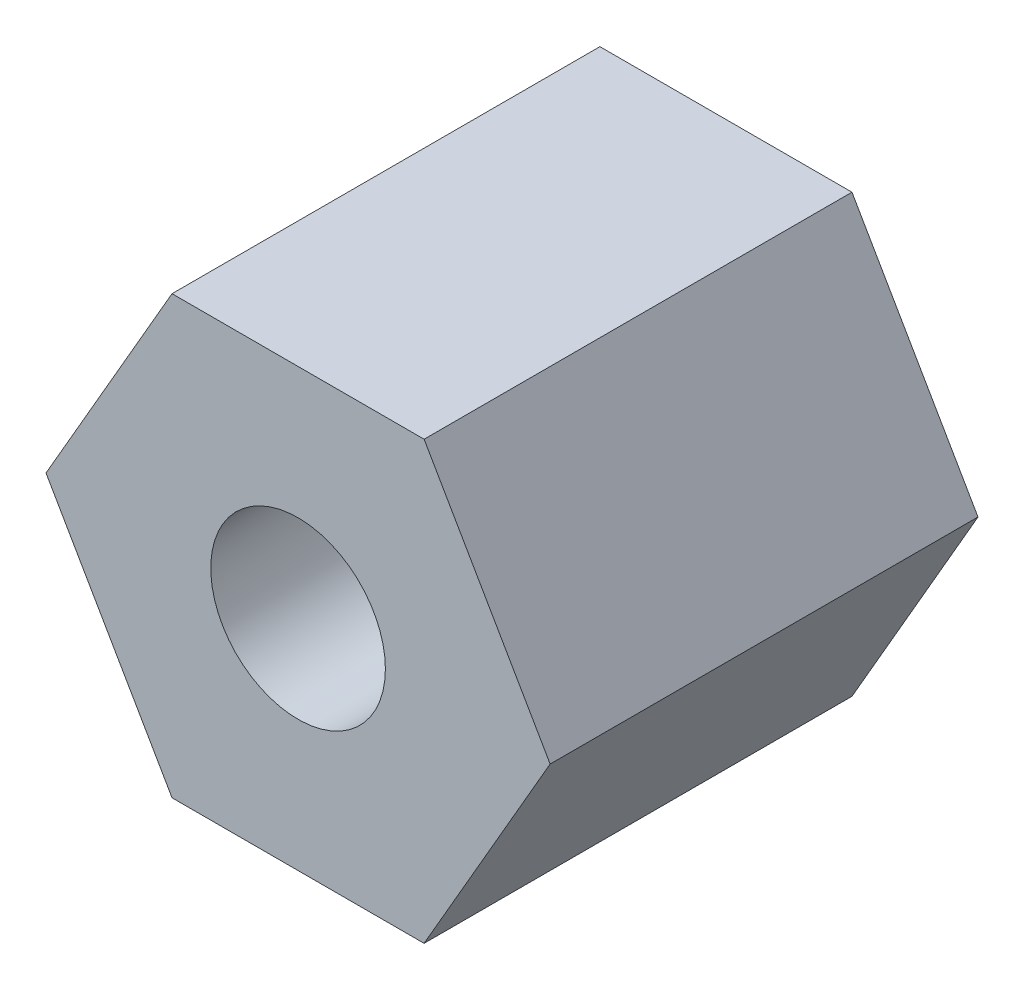
ISO-10303-21;
HEADER;
FILE_DESCRIPTION(('STEP AP214'),'2;1');
FILE_NAME('part.step','',(''),(''),'','','');
FILE_SCHEMA(('AUTOMOTIVE_DESIGN { 1 0 10303 214 1 1 1 1 }'));
ENDSEC;
DATA;
#1=APPLICATION_CONTEXT('core data for automotive mechanical design processes');
#2=APPLICATION_PROTOCOL_DEFINITION('international standard','automotive_design',2000,#1);
#3=PRODUCT_CONTEXT('',#1,'mechanical');
#4=PRODUCT('Part','Part','',(#3));
#5=PRODUCT_RELATED_PRODUCT_CATEGORY('part','',(#4));
#6=PRODUCT_DEFINITION_FORMATION('','',#4);
#7=PRODUCT_DEFINITION_CONTEXT('part definition',#1,'design');
#8=PRODUCT_DEFINITION('design','',#6,#7);
#9=PRODUCT_DEFINITION_SHAPE('','',#8);
#10=(LENGTH_UNIT() NAMED_UNIT(*) SI_UNIT(.MILLI.,.METRE.));
#11=(NAMED_UNIT(*) PLANE_ANGLE_UNIT() SI_UNIT($,.RADIAN.));
#12=(NAMED_UNIT(*) SI_UNIT($,.STERADIAN.) SOLID_ANGLE_UNIT());
#13=UNCERTAINTY_MEASURE_WITH_UNIT(LENGTH_MEASURE(1.E-05),#10,'distance_accuracy_value','');
#14=(GEOMETRIC_REPRESENTATION_CONTEXT(3) GLOBAL_UNCERTAINTY_ASSIGNED_CONTEXT((#13)) GLOBAL_UNIT_ASSIGNED_CONTEXT((#10,
#11,#12)) REPRESENTATION_CONTEXT('',''));
#15=CARTESIAN_POINT('',(0.,0.,0.));
#16=DIRECTION('',(0.,0.,1.));
#17=DIRECTION('',(1.,0.,0.));
#18=AXIS2_PLACEMENT_3D('',#15,#16,#17);
#19=CARTESIAN_POINT('',(0.,0.,9.8));
#20=DIRECTION('',(0.,0.,1.));
#21=DIRECTION('',(1.,0.,0.));
#22=AXIS2_PLACEMENT_3D('',#19,#20,#21);
#23=PLANE('',#22);
#24=DIRECTION('',(1.,0.,0.));
#25=VECTOR('',#24,1.);
#26=CARTESIAN_POINT('',(-2.88675134594813,-5.,9.8));
#27=LINE('',#26,#25);
#28=CARTESIAN_POINT('',(-2.88675134594813,-5.,9.8));
#29=VERTEX_POINT('',#28);
#30=CARTESIAN_POINT('',(2.88675134594813,-5.,9.8));
#31=VERTEX_POINT('',#30);
#32=EDGE_CURVE('E131',#29,#31,#27,.T.);
#33=ORIENTED_EDGE('',*,*,#32,.T.);
#34=DIRECTION('',(0.5,0.866025403784439,0.));
#35=VECTOR('',#34,1.);
#36=CARTESIAN_POINT('',(2.88675134594813,-5.,9.8));
#37=LINE('',#36,#35);
#38=CARTESIAN_POINT('',(5.77350269189626,0.,9.8));
#39=VERTEX_POINT('',#38);
#40=EDGE_CURVE('E89',#31,#39,#37,.T.);
#41=ORIENTED_EDGE('',*,*,#40,.T.);
#42=DIRECTION('',(-0.5,0.866025403784438,0.));
#43=VECTOR('',#42,1.);
#44=CARTESIAN_POINT('',(5.77350269189626,0.,9.8));
#45=LINE('',#44,#43);
#46=CARTESIAN_POINT('',(2.88675134594813,5.,9.8));
#47=VERTEX_POINT('',#46);
#48=EDGE_CURVE('E102',#39,#47,#45,.T.);
#49=ORIENTED_EDGE('',*,*,#48,.T.);
#50=DIRECTION('',(-1.,0.,0.));
#51=VECTOR('',#50,1.);
#52=CARTESIAN_POINT('',(2.88675134594813,5.,9.8));
#53=LINE('',#52,#51);
#54=CARTESIAN_POINT('',(-2.88675134594813,5.,9.8));
#55=VERTEX_POINT('',#54);
#56=EDGE_CURVE('E96',#47,#55,#53,.T.);
#57=ORIENTED_EDGE('',*,*,#56,.T.);
#58=DIRECTION('',(-0.5,-0.866025403784439,0.));
#59=VECTOR('',#58,1.);
#60=CARTESIAN_POINT('',(-2.88675134594813,5.,9.8));
#61=LINE('',#60,#59);
#62=CARTESIAN_POINT('',(-5.77350269189626,0.,9.8));
#63=VERTEX_POINT('',#62);
#64=EDGE_CURVE('E100',#55,#63,#61,.T.);
#65=ORIENTED_EDGE('',*,*,#64,.T.);
#66=DIRECTION('',(0.5,-0.866025403784439,0.));
#67=VECTOR('',#66,1.);
#68=CARTESIAN_POINT('',(-5.77350269189626,0.,9.8));
#69=LINE('',#68,#67);
#70=EDGE_CURVE('E52',#63,#29,#69,.T.);
#71=ORIENTED_EDGE('',*,*,#70,.T.);
#72=EDGE_LOOP('',(#33,#41,#49,#57,#65,#71));
#73=FACE_BOUND('',#72,.T.);
#74=CARTESIAN_POINT('',(0.,0.,9.8));
#75=DIRECTION('',(0.,0.,1.));
#76=DIRECTION('',(1.,0.,0.));
#77=AXIS2_PLACEMENT_3D('',#74,#75,#76);
#78=CIRCLE('',#77,2.);
#79=CARTESIAN_POINT('',(2.,0.,9.8));
#80=VERTEX_POINT('',#79);
#81=EDGE_CURVE('E124',#80,#80,#78,.T.);
#82=ORIENTED_EDGE('',*,*,#81,.F.);
#83=EDGE_LOOP('',(#82));
#84=FACE_BOUND('',#83,.T.);
#85=ADVANCED_FACE('F35',(#73,#84),#23,.T.);
#86=CARTESIAN_POINT('',(0.,0.,0.));
#87=DIRECTION('',(0.,0.,1.));
#88=DIRECTION('',(1.,0.,0.));
#89=AXIS2_PLACEMENT_3D('',#86,#87,#88);
#90=PLANE('',#89);
#91=DIRECTION('',(1.,0.,0.));
#92=VECTOR('',#91,1.);
#93=CARTESIAN_POINT('',(-2.88675134594813,-5.,0.));
#94=LINE('',#93,#92);
#95=CARTESIAN_POINT('',(-2.88675134594813,-5.,0.));
#96=VERTEX_POINT('',#95);
#97=CARTESIAN_POINT('',(2.88675134594813,-5.,0.));
#98=VERTEX_POINT('',#97);
#99=EDGE_CURVE('E120',#96,#98,#94,.T.);
#100=ORIENTED_EDGE('',*,*,#99,.F.);
#101=DIRECTION('',(0.5,-0.866025403784439,0.));
#102=VECTOR('',#101,1.);
#103=CARTESIAN_POINT('',(-5.77350269189626,0.,0.));
#104=LINE('',#103,#102);
#105=CARTESIAN_POINT('',(-5.77350269189626,0.,0.));
#106=VERTEX_POINT('',#105);
#107=EDGE_CURVE('E81',#106,#96,#104,.T.);
#108=ORIENTED_EDGE('',*,*,#107,.F.);
#109=DIRECTION('',(-0.5,-0.866025403784439,0.));
#110=VECTOR('',#109,1.);
#111=CARTESIAN_POINT('',(-2.88675134594813,5.,0.));
#112=LINE('',#111,#110);
#113=CARTESIAN_POINT('',(-2.88675134594813,5.,0.));
#114=VERTEX_POINT('',#113);
#115=EDGE_CURVE('E75',#114,#106,#112,.T.);
#116=ORIENTED_EDGE('',*,*,#115,.F.);
#117=DIRECTION('',(-1.,0.,0.));
#118=VECTOR('',#117,1.);
#119=CARTESIAN_POINT('',(2.88675134594813,5.,0.));
#120=LINE('',#119,#118);
#121=CARTESIAN_POINT('',(2.88675134594813,5.,0.));
#122=VERTEX_POINT('',#121);
#123=EDGE_CURVE('E110',#122,#114,#120,.T.);
#124=ORIENTED_EDGE('',*,*,#123,.F.);
#125=DIRECTION('',(-0.5,0.866025403784438,0.));
#126=VECTOR('',#125,1.);
#127=CARTESIAN_POINT('',(5.77350269189626,0.,0.));
#128=LINE('',#127,#126);
#129=CARTESIAN_POINT('',(5.77350269189626,0.,0.));
#130=VERTEX_POINT('',#129);
#131=EDGE_CURVE('E126',#130,#122,#128,.T.);
#132=ORIENTED_EDGE('',*,*,#131,.F.);
#133=DIRECTION('',(0.5,0.866025403784439,0.));
#134=VECTOR('',#133,1.);
#135=CARTESIAN_POINT('',(2.88675134594813,-5.,0.));
#136=LINE('',#135,#134);
#137=EDGE_CURVE('E123',#98,#130,#136,.T.);
#138=ORIENTED_EDGE('',*,*,#137,.F.);
#139=EDGE_LOOP('',(#100,#108,#116,#124,#132,#138));
#140=FACE_BOUND('',#139,.T.);
#141=CARTESIAN_POINT('',(0.,0.,0.));
#142=DIRECTION('',(0.,0.,1.));
#143=DIRECTION('',(1.,0.,0.));
#144=AXIS2_PLACEMENT_3D('',#141,#142,#143);
#145=CIRCLE('',#144,2.);
#146=CARTESIAN_POINT('',(2.,0.,0.));
#147=VERTEX_POINT('',#146);
#148=EDGE_CURVE('E224',#147,#147,#145,.T.);
#149=ORIENTED_EDGE('',*,*,#148,.T.);
#150=EDGE_LOOP('',(#149));
#151=FACE_BOUND('',#150,.T.);
#152=ADVANCED_FACE('F140',(#140,#151),#90,.F.);
#153=CARTESIAN_POINT('',(-2.88675134594813,-5.,9.8));
#154=DIRECTION('',(0.,1.,0.));
#155=DIRECTION('',(0.,0.,1.));
#156=AXIS2_PLACEMENT_3D('',#153,#154,#155);
#157=PLANE('',#156);
#158=ORIENTED_EDGE('',*,*,#99,.T.);
#159=DIRECTION('',(0.,0.,-1.));
#160=VECTOR('',#159,1.);
#161=CARTESIAN_POINT('',(2.88675134594813,-5.,9.8));
#162=LINE('',#161,#160);
#163=EDGE_CURVE('E11',#31,#98,#162,.T.);
#164=ORIENTED_EDGE('',*,*,#163,.F.);
#165=ORIENTED_EDGE('',*,*,#32,.F.);
#166=DIRECTION('',(0.,0.,-1.));
#167=VECTOR('',#166,1.);
#168=CARTESIAN_POINT('',(-2.88675134594813,-5.,9.8));
#169=LINE('',#168,#167);
#170=EDGE_CURVE('E116',#29,#96,#169,.T.);
#171=ORIENTED_EDGE('',*,*,#170,.T.);
#172=EDGE_LOOP('',(#158,#164,#165,#171));
#173=FACE_BOUND('',#172,.T.);
#174=ADVANCED_FACE('F37',(#173),#157,.F.);
#175=CARTESIAN_POINT('',(2.88675134594813,-5.,9.8));
#176=DIRECTION('',(-0.866025403784439,0.5,0.));
#177=DIRECTION('',(-0.5,-0.866025403784439,0.));
#178=AXIS2_PLACEMENT_3D('',#175,#176,#177);
#179=PLANE('',#178);
#180=ORIENTED_EDGE('',*,*,#137,.T.);
#181=DIRECTION('',(0.,0.,-1.));
#182=VECTOR('',#181,1.);
#183=CARTESIAN_POINT('',(5.77350269189626,0.,9.8));
#184=LINE('',#183,#182);
#185=EDGE_CURVE('E44',#39,#130,#184,.T.);
#186=ORIENTED_EDGE('',*,*,#185,.F.);
#187=ORIENTED_EDGE('',*,*,#40,.F.);
#188=ORIENTED_EDGE('',*,*,#163,.T.);
#189=EDGE_LOOP('',(#180,#186,#187,#188));
#190=FACE_BOUND('',#189,.T.);
#191=ADVANCED_FACE('F165',(#190),#179,.F.);
#192=CARTESIAN_POINT('',(5.77350269189626,0.,9.8));
#193=DIRECTION('',(-0.866025403784439,-0.5,0.));
#194=DIRECTION('',(0.5,-0.866025403784439,0.));
#195=AXIS2_PLACEMENT_3D('',#192,#193,#194);
#196=PLANE('',#195);
#197=ORIENTED_EDGE('',*,*,#131,.T.);
#198=DIRECTION('',(0.,0.,-1.));
#199=VECTOR('',#198,1.);
#200=CARTESIAN_POINT('',(2.88675134594813,5.,9.8));
#201=LINE('',#200,#199);
#202=EDGE_CURVE('E111',#47,#122,#201,.T.);
#203=ORIENTED_EDGE('',*,*,#202,.F.);
#204=ORIENTED_EDGE('',*,*,#48,.F.);
#205=ORIENTED_EDGE('',*,*,#185,.T.);
#206=EDGE_LOOP('',(#197,#203,#204,#205));
#207=FACE_BOUND('',#206,.T.);
#208=ADVANCED_FACE('F137',(#207),#196,.F.);
#209=CARTESIAN_POINT('',(2.88675134594813,5.,9.8));
#210=DIRECTION('',(0.,-1.,0.));
#211=DIRECTION('',(1.,0.,0.));
#212=AXIS2_PLACEMENT_3D('',#209,#210,#211);
#213=PLANE('',#212);
#214=ORIENTED_EDGE('',*,*,#123,.T.);
#215=DIRECTION('',(0.,0.,-1.));
#216=VECTOR('',#215,1.);
#217=CARTESIAN_POINT('',(-2.88675134594813,5.,9.8));
#218=LINE('',#217,#216);
#219=EDGE_CURVE('E107',#55,#114,#218,.T.);
#220=ORIENTED_EDGE('',*,*,#219,.F.);
#221=ORIENTED_EDGE('',*,*,#56,.F.);
#222=ORIENTED_EDGE('',*,*,#202,.T.);
#223=EDGE_LOOP('',(#214,#220,#221,#222));
#224=FACE_BOUND('',#223,.T.);
#225=ADVANCED_FACE('F108',(#224),#213,.F.);
#226=CARTESIAN_POINT('',(-2.88675134594813,5.,9.8));
#227=DIRECTION('',(0.866025403784439,-0.5,0.));
#228=DIRECTION('',(0.5,0.866025403784439,0.));
#229=AXIS2_PLACEMENT_3D('',#226,#227,#228);
#230=PLANE('',#229);
#231=ORIENTED_EDGE('',*,*,#115,.T.);
#232=DIRECTION('',(0.,0.,-1.));
#233=VECTOR('',#232,1.);
#234=CARTESIAN_POINT('',(-5.77350269189626,0.,9.8));
#235=LINE('',#234,#233);
#236=EDGE_CURVE('E112',#63,#106,#235,.T.);
#237=ORIENTED_EDGE('',*,*,#236,.F.);
#238=ORIENTED_EDGE('',*,*,#64,.F.);
#239=ORIENTED_EDGE('',*,*,#219,.T.);
#240=EDGE_LOOP('',(#231,#237,#238,#239));
#241=FACE_BOUND('',#240,.T.);
#242=ADVANCED_FACE('F114',(#241),#230,.F.);
#243=CARTESIAN_POINT('',(-5.77350269189626,0.,9.8));
#244=DIRECTION('',(0.866025403784439,0.5,0.));
#245=DIRECTION('',(-0.5,0.866025403784439,0.));
#246=AXIS2_PLACEMENT_3D('',#243,#244,#245);
#247=PLANE('',#246);
#248=ORIENTED_EDGE('',*,*,#107,.T.);
#249=ORIENTED_EDGE('',*,*,#170,.F.);
#250=ORIENTED_EDGE('',*,*,#70,.F.);
#251=ORIENTED_EDGE('',*,*,#236,.T.);
#252=EDGE_LOOP('',(#248,#249,#250,#251));
#253=FACE_BOUND('',#252,.T.);
#254=ADVANCED_FACE('F145',(#253),#247,.F.);
#255=CARTESIAN_POINT('',(0.,0.,9.8));
#256=DIRECTION('',(0.,0.,-1.));
#257=DIRECTION('',(-1.,0.,0.));
#258=AXIS2_PLACEMENT_3D('',#255,#256,#257);
#259=CYLINDRICAL_SURFACE('',#258,2.);
#260=ORIENTED_EDGE('',*,*,#81,.T.);
#261=EDGE_LOOP('',(#260));
#262=FACE_BOUND('',#261,.T.);
#263=ORIENTED_EDGE('',*,*,#148,.F.);
#264=EDGE_LOOP('',(#263));
#265=FACE_BOUND('',#264,.T.);
#266=ADVANCED_FACE('F147',(#262,#265),#259,.F.);
#267=CLOSED_SHELL('',(#85,#152,#174,#191,#208,#225,#242,#254,#266));
#268=MANIFOLD_SOLID_BREP('B2',#267);
#269=ADVANCED_BREP_SHAPE_REPRESENTATION('',(#18,#268),#14);
#270=SHAPE_DEFINITION_REPRESENTATION(#9,#269);
ENDSEC;
END-ISO-10303-21;
